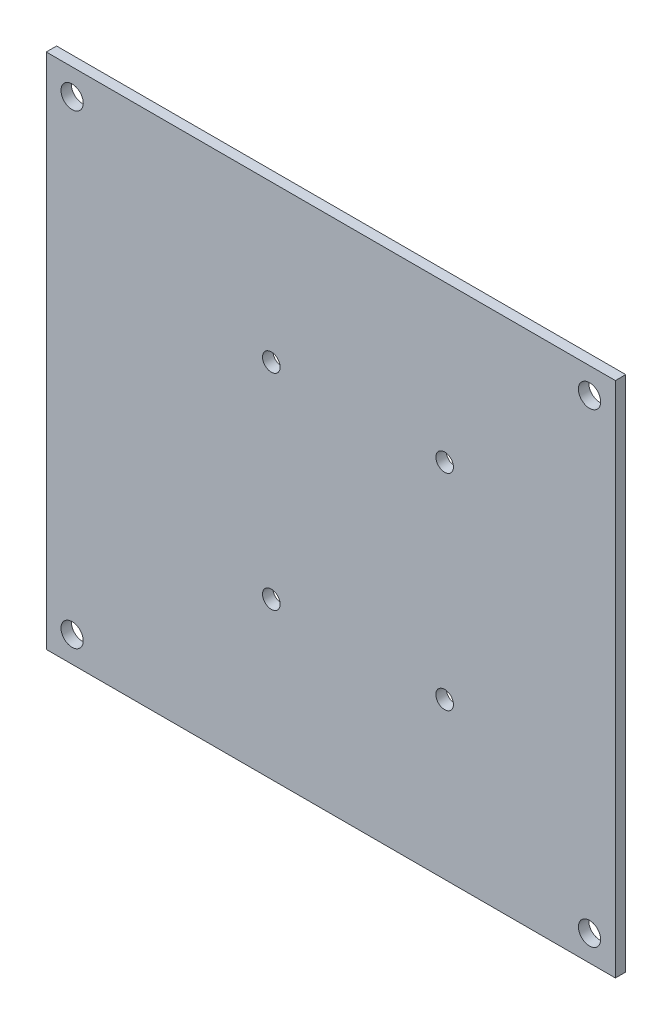
ISO-10303-21;
HEADER;
FILE_DESCRIPTION(('STEP AP214'),'2;1');
FILE_NAME('part.step','',(''),(''),'','','');
FILE_SCHEMA(('AUTOMOTIVE_DESIGN { 1 0 10303 214 1 1 1 1 }'));
ENDSEC;
DATA;
#1=APPLICATION_CONTEXT('core data for automotive mechanical design processes');
#2=APPLICATION_PROTOCOL_DEFINITION('international standard','automotive_design',2000,#1);
#3=PRODUCT_CONTEXT('',#1,'mechanical');
#4=PRODUCT('Part','Part','',(#3));
#5=PRODUCT_RELATED_PRODUCT_CATEGORY('part','',(#4));
#6=PRODUCT_DEFINITION_FORMATION('','',#4);
#7=PRODUCT_DEFINITION_CONTEXT('part definition',#1,'design');
#8=PRODUCT_DEFINITION('design','',#6,#7);
#9=PRODUCT_DEFINITION_SHAPE('','',#8);
#10=(LENGTH_UNIT() NAMED_UNIT(*) SI_UNIT(.MILLI.,.METRE.));
#11=(NAMED_UNIT(*) PLANE_ANGLE_UNIT() SI_UNIT($,.RADIAN.));
#12=(NAMED_UNIT(*) SI_UNIT($,.STERADIAN.) SOLID_ANGLE_UNIT());
#13=UNCERTAINTY_MEASURE_WITH_UNIT(LENGTH_MEASURE(1.E-05),#10,'distance_accuracy_value','');
#14=(GEOMETRIC_REPRESENTATION_CONTEXT(3) GLOBAL_UNCERTAINTY_ASSIGNED_CONTEXT((#13)) GLOBAL_UNIT_ASSIGNED_CONTEXT((#10,
#11,#12)) REPRESENTATION_CONTEXT('',''));
#15=CARTESIAN_POINT('',(0.,0.,0.));
#16=DIRECTION('',(0.,0.,1.));
#17=DIRECTION('',(1.,0.,0.));
#18=AXIS2_PLACEMENT_3D('',#15,#16,#17);
#19=CARTESIAN_POINT('',(0.,0.,1.));
#20=DIRECTION('',(0.,0.,1.));
#21=DIRECTION('',(1.,0.,0.));
#22=AXIS2_PLACEMENT_3D('',#19,#20,#21);
#23=PLANE('',#22);
#24=CARTESIAN_POINT('',(-11.5000000000023,19.8500000000001,1.));
#25=DIRECTION('',(0.,0.,1.));
#26=DIRECTION('',(1.,0.,0.));
#27=AXIS2_PLACEMENT_3D('',#24,#25,#26);
#28=CIRCLE('',#27,1.7);
#29=CARTESIAN_POINT('',(-9.80000000000229,19.8500000000001,1.));
#30=VERTEX_POINT('',#29);
#31=EDGE_CURVE('E300',#30,#30,#28,.T.);
#32=ORIENTED_EDGE('',*,*,#31,.F.);
#33=EDGE_LOOP('',(#32));
#34=FACE_BOUND('',#33,.T.);
#35=CARTESIAN_POINT('',(21.9999999999971,-19.8859328867593,1.));
#36=DIRECTION('',(0.,0.,1.));
#37=DIRECTION('',(1.,0.,0.));
#38=AXIS2_PLACEMENT_3D('',#35,#36,#37);
#39=CIRCLE('',#38,1.7);
#40=CARTESIAN_POINT('',(23.6999999999971,-19.8859328867593,1.));
#41=VERTEX_POINT('',#40);
#42=EDGE_CURVE('E301',#41,#41,#39,.T.);
#43=ORIENTED_EDGE('',*,*,#42,.F.);
#44=EDGE_LOOP('',(#43));
#45=FACE_BOUND('',#44,.T.);
#46=CARTESIAN_POINT('',(-11.5000000000023,-19.8500000000009,1.));
#47=DIRECTION('',(0.,0.,1.));
#48=DIRECTION('',(1.,0.,0.));
#49=AXIS2_PLACEMENT_3D('',#46,#47,#48);
#50=CIRCLE('',#49,1.7);
#51=CARTESIAN_POINT('',(-9.80000000000229,-19.8500000000009,1.));
#52=VERTEX_POINT('',#51);
#53=EDGE_CURVE('E305',#52,#52,#50,.T.);
#54=ORIENTED_EDGE('',*,*,#53,.F.);
#55=EDGE_LOOP('',(#54));
#56=FACE_BOUND('',#55,.T.);
#57=CARTESIAN_POINT('',(21.9999999999971,19.8500000000001,1.));
#58=DIRECTION('',(0.,0.,1.));
#59=DIRECTION('',(1.,0.,0.));
#60=AXIS2_PLACEMENT_3D('',#57,#58,#59);
#61=CIRCLE('',#60,1.7);
#62=CARTESIAN_POINT('',(23.6999999999971,19.8500000000001,1.));
#63=VERTEX_POINT('',#62);
#64=EDGE_CURVE('E115',#63,#63,#61,.T.);
#65=ORIENTED_EDGE('',*,*,#64,.F.);
#66=EDGE_LOOP('',(#65));
#67=FACE_BOUND('',#66,.T.);
#68=CARTESIAN_POINT('',(50.,-45.,1.));
#69=DIRECTION('',(0.,0.,1.));
#70=DIRECTION('',(1.,0.,0.));
#71=AXIS2_PLACEMENT_3D('',#68,#69,#70);
#72=CIRCLE('',#71,2.15);
#73=CARTESIAN_POINT('',(52.15,-45.,1.));
#74=VERTEX_POINT('',#73);
#75=EDGE_CURVE('E135',#74,#74,#72,.T.);
#76=ORIENTED_EDGE('',*,*,#75,.F.);
#77=EDGE_LOOP('',(#76));
#78=FACE_BOUND('',#77,.T.);
#79=CARTESIAN_POINT('',(-50.,45.,1.));
#80=DIRECTION('',(0.,0.,1.));
#81=DIRECTION('',(1.,0.,0.));
#82=AXIS2_PLACEMENT_3D('',#79,#80,#81);
#83=CIRCLE('',#82,2.15);
#84=CARTESIAN_POINT('',(-47.85,45.,1.));
#85=VERTEX_POINT('',#84);
#86=EDGE_CURVE('E105',#85,#85,#83,.T.);
#87=ORIENTED_EDGE('',*,*,#86,.F.);
#88=EDGE_LOOP('',(#87));
#89=FACE_BOUND('',#88,.T.);
#90=DIRECTION('',(0.,1.,0.));
#91=VECTOR('',#90,1.);
#92=CARTESIAN_POINT('',(55.,50.,1.));
#93=LINE('',#92,#91);
#94=CARTESIAN_POINT('',(55.,-50.,1.));
#95=VERTEX_POINT('',#94);
#96=CARTESIAN_POINT('',(55.,50.,1.));
#97=VERTEX_POINT('',#96);
#98=EDGE_CURVE('E89',#95,#97,#93,.T.);
#99=ORIENTED_EDGE('',*,*,#98,.T.);
#100=DIRECTION('',(-1.,0.,0.));
#101=VECTOR('',#100,1.);
#102=CARTESIAN_POINT('',(-55.,50.,1.));
#103=LINE('',#102,#101);
#104=CARTESIAN_POINT('',(-55.,50.,1.));
#105=VERTEX_POINT('',#104);
#106=EDGE_CURVE('E84',#97,#105,#103,.T.);
#107=ORIENTED_EDGE('',*,*,#106,.T.);
#108=DIRECTION('',(0.,-1.,0.));
#109=VECTOR('',#108,1.);
#110=CARTESIAN_POINT('',(-55.,50.,1.));
#111=LINE('',#110,#109);
#112=CARTESIAN_POINT('',(-55.,-50.,1.));
#113=VERTEX_POINT('',#112);
#114=EDGE_CURVE('E87',#105,#113,#111,.T.);
#115=ORIENTED_EDGE('',*,*,#114,.T.);
#116=DIRECTION('',(1.,0.,0.));
#117=VECTOR('',#116,1.);
#118=CARTESIAN_POINT('',(-55.,-50.,1.));
#119=LINE('',#118,#117);
#120=EDGE_CURVE('E54',#113,#95,#119,.T.);
#121=ORIENTED_EDGE('',*,*,#120,.T.);
#122=EDGE_LOOP('',(#99,#107,#115,#121));
#123=FACE_BOUND('',#122,.T.);
#124=CARTESIAN_POINT('',(50.,45.,1.));
#125=DIRECTION('',(0.,0.,1.));
#126=DIRECTION('',(-1.,0.,0.));
#127=AXIS2_PLACEMENT_3D('',#124,#125,#126);
#128=CIRCLE('',#127,2.15);
#129=CARTESIAN_POINT('',(47.85,45.,1.));
#130=VERTEX_POINT('',#129);
#131=EDGE_CURVE('E141',#130,#130,#128,.T.);
#132=ORIENTED_EDGE('',*,*,#131,.F.);
#133=EDGE_LOOP('',(#132));
#134=FACE_BOUND('',#133,.T.);
#135=CARTESIAN_POINT('',(-50.,-45.,1.));
#136=DIRECTION('',(0.,0.,1.));
#137=DIRECTION('',(-1.,0.,0.));
#138=AXIS2_PLACEMENT_3D('',#135,#136,#137);
#139=CIRCLE('',#138,2.15);
#140=CARTESIAN_POINT('',(-52.15,-45.,1.));
#141=VERTEX_POINT('',#140);
#142=EDGE_CURVE('E126',#141,#141,#139,.T.);
#143=ORIENTED_EDGE('',*,*,#142,.F.);
#144=EDGE_LOOP('',(#143));
#145=FACE_BOUND('',#144,.T.);
#146=ADVANCED_FACE('F35',(#34,#45,#56,#67,#78,#89,#123,#134,#145),#23,.T.);
#147=CARTESIAN_POINT('',(0.,0.,-1.));
#148=DIRECTION('',(0.,0.,1.));
#149=DIRECTION('',(1.,0.,0.));
#150=AXIS2_PLACEMENT_3D('',#147,#148,#149);
#151=PLANE('',#150);
#152=CARTESIAN_POINT('',(-11.5000000000023,19.8500000000001,-1.));
#153=DIRECTION('',(0.,0.,1.));
#154=DIRECTION('',(1.,0.,0.));
#155=AXIS2_PLACEMENT_3D('',#152,#153,#154);
#156=CIRCLE('',#155,1.7);
#157=CARTESIAN_POINT('',(-9.80000000000229,19.8500000000001,-1.));
#158=VERTEX_POINT('',#157);
#159=EDGE_CURVE('E39',#158,#158,#156,.T.);
#160=ORIENTED_EDGE('',*,*,#159,.T.);
#161=EDGE_LOOP('',(#160));
#162=FACE_BOUND('',#161,.T.);
#163=CARTESIAN_POINT('',(21.9999999999971,-19.8859328867593,-1.));
#164=DIRECTION('',(0.,0.,1.));
#165=DIRECTION('',(1.,0.,0.));
#166=AXIS2_PLACEMENT_3D('',#163,#164,#165);
#167=CIRCLE('',#166,1.7);
#168=CARTESIAN_POINT('',(23.6999999999971,-19.8859328867593,-1.));
#169=VERTEX_POINT('',#168);
#170=EDGE_CURVE('E117',#169,#169,#167,.T.);
#171=ORIENTED_EDGE('',*,*,#170,.T.);
#172=EDGE_LOOP('',(#171));
#173=FACE_BOUND('',#172,.T.);
#174=CARTESIAN_POINT('',(-11.5000000000023,-19.8500000000009,-1.));
#175=DIRECTION('',(0.,0.,1.));
#176=DIRECTION('',(1.,0.,0.));
#177=AXIS2_PLACEMENT_3D('',#174,#175,#176);
#178=CIRCLE('',#177,1.7);
#179=CARTESIAN_POINT('',(-9.80000000000229,-19.8500000000009,-1.));
#180=VERTEX_POINT('',#179);
#181=EDGE_CURVE('E114',#180,#180,#178,.T.);
#182=ORIENTED_EDGE('',*,*,#181,.T.);
#183=EDGE_LOOP('',(#182));
#184=FACE_BOUND('',#183,.T.);
#185=CARTESIAN_POINT('',(21.9999999999971,19.8500000000001,-1.));
#186=DIRECTION('',(0.,0.,1.));
#187=DIRECTION('',(1.,0.,0.));
#188=AXIS2_PLACEMENT_3D('',#185,#186,#187);
#189=CIRCLE('',#188,1.7);
#190=CARTESIAN_POINT('',(23.6999999999971,19.8500000000001,-1.));
#191=VERTEX_POINT('',#190);
#192=EDGE_CURVE('E111',#191,#191,#189,.T.);
#193=ORIENTED_EDGE('',*,*,#192,.T.);
#194=EDGE_LOOP('',(#193));
#195=FACE_BOUND('',#194,.T.);
#196=DIRECTION('',(0.,1.,0.));
#197=VECTOR('',#196,1.);
#198=CARTESIAN_POINT('',(55.,50.,-1.));
#199=LINE('',#198,#197);
#200=CARTESIAN_POINT('',(55.,-50.,-1.));
#201=VERTEX_POINT('',#200);
#202=CARTESIAN_POINT('',(55.,50.,-1.));
#203=VERTEX_POINT('',#202);
#204=EDGE_CURVE('E102',#201,#203,#199,.T.);
#205=ORIENTED_EDGE('',*,*,#204,.F.);
#206=DIRECTION('',(1.,0.,0.));
#207=VECTOR('',#206,1.);
#208=CARTESIAN_POINT('',(-55.,-50.,-1.));
#209=LINE('',#208,#207);
#210=CARTESIAN_POINT('',(-55.,-50.,-1.));
#211=VERTEX_POINT('',#210);
#212=EDGE_CURVE('E77',#211,#201,#209,.T.);
#213=ORIENTED_EDGE('',*,*,#212,.F.);
#214=DIRECTION('',(0.,-1.,0.));
#215=VECTOR('',#214,1.);
#216=CARTESIAN_POINT('',(-55.,50.,-1.));
#217=LINE('',#216,#215);
#218=CARTESIAN_POINT('',(-55.,50.,-1.));
#219=VERTEX_POINT('',#218);
#220=EDGE_CURVE('E71',#219,#211,#217,.T.);
#221=ORIENTED_EDGE('',*,*,#220,.F.);
#222=DIRECTION('',(-1.,0.,0.));
#223=VECTOR('',#222,1.);
#224=CARTESIAN_POINT('',(-55.,50.,-1.));
#225=LINE('',#224,#223);
#226=EDGE_CURVE('E93',#203,#219,#225,.T.);
#227=ORIENTED_EDGE('',*,*,#226,.F.);
#228=EDGE_LOOP('',(#205,#213,#221,#227));
#229=FACE_BOUND('',#228,.T.);
#230=CARTESIAN_POINT('',(-50.,45.,-1.));
#231=DIRECTION('',(0.,0.,1.));
#232=DIRECTION('',(1.,0.,0.));
#233=AXIS2_PLACEMENT_3D('',#230,#231,#232);
#234=CIRCLE('',#233,2.15);
#235=CARTESIAN_POINT('',(-47.85,45.,-1.));
#236=VERTEX_POINT('',#235);
#237=EDGE_CURVE('E144',#236,#236,#234,.T.);
#238=ORIENTED_EDGE('',*,*,#237,.T.);
#239=EDGE_LOOP('',(#238));
#240=FACE_BOUND('',#239,.T.);
#241=CARTESIAN_POINT('',(50.,45.,-1.));
#242=DIRECTION('',(0.,0.,1.));
#243=DIRECTION('',(-1.,0.,0.));
#244=AXIS2_PLACEMENT_3D('',#241,#242,#243);
#245=CIRCLE('',#244,2.15);
#246=CARTESIAN_POINT('',(47.85,45.,-1.));
#247=VERTEX_POINT('',#246);
#248=EDGE_CURVE('E138',#247,#247,#245,.T.);
#249=ORIENTED_EDGE('',*,*,#248,.T.);
#250=EDGE_LOOP('',(#249));
#251=FACE_BOUND('',#250,.T.);
#252=CARTESIAN_POINT('',(50.,-45.,-1.));
#253=DIRECTION('',(0.,0.,1.));
#254=DIRECTION('',(1.,0.,0.));
#255=AXIS2_PLACEMENT_3D('',#252,#253,#254);
#256=CIRCLE('',#255,2.15);
#257=CARTESIAN_POINT('',(52.15,-45.,-1.));
#258=VERTEX_POINT('',#257);
#259=EDGE_CURVE('E131',#258,#258,#256,.T.);
#260=ORIENTED_EDGE('',*,*,#259,.T.);
#261=EDGE_LOOP('',(#260));
#262=FACE_BOUND('',#261,.T.);
#263=CARTESIAN_POINT('',(-50.,-45.,-1.));
#264=DIRECTION('',(0.,0.,1.));
#265=DIRECTION('',(-1.,0.,0.));
#266=AXIS2_PLACEMENT_3D('',#263,#264,#265);
#267=CIRCLE('',#266,2.15);
#268=CARTESIAN_POINT('',(-52.15,-45.,-1.));
#269=VERTEX_POINT('',#268);
#270=EDGE_CURVE('E122',#269,#269,#267,.T.);
#271=ORIENTED_EDGE('',*,*,#270,.T.);
#272=EDGE_LOOP('',(#271));
#273=FACE_BOUND('',#272,.T.);
#274=ADVANCED_FACE('F152',(#162,#173,#184,#195,#229,#240,#251,#262,#273),#151,.F.);
#275=CARTESIAN_POINT('',(55.,50.,1.));
#276=DIRECTION('',(-1.,0.,0.));
#277=DIRECTION('',(0.,0.,1.));
#278=AXIS2_PLACEMENT_3D('',#275,#276,#277);
#279=PLANE('',#278);
#280=ORIENTED_EDGE('',*,*,#204,.T.);
#281=DIRECTION('',(0.,0.,-1.));
#282=VECTOR('',#281,1.);
#283=CARTESIAN_POINT('',(55.,50.,1.));
#284=LINE('',#283,#282);
#285=EDGE_CURVE('E11',#97,#203,#284,.T.);
#286=ORIENTED_EDGE('',*,*,#285,.F.);
#287=ORIENTED_EDGE('',*,*,#98,.F.);
#288=DIRECTION('',(0.,0.,-1.));
#289=VECTOR('',#288,1.);
#290=CARTESIAN_POINT('',(55.,-50.,1.));
#291=LINE('',#290,#289);
#292=EDGE_CURVE('E98',#95,#201,#291,.T.);
#293=ORIENTED_EDGE('',*,*,#292,.T.);
#294=EDGE_LOOP('',(#280,#286,#287,#293));
#295=FACE_BOUND('',#294,.T.);
#296=ADVANCED_FACE('F37',(#295),#279,.F.);
#297=CARTESIAN_POINT('',(-55.,50.,1.));
#298=DIRECTION('',(0.,-1.,0.));
#299=DIRECTION('',(0.,0.,-1.));
#300=AXIS2_PLACEMENT_3D('',#297,#298,#299);
#301=PLANE('',#300);
#302=ORIENTED_EDGE('',*,*,#226,.T.);
#303=DIRECTION('',(0.,0.,-1.));
#304=VECTOR('',#303,1.);
#305=CARTESIAN_POINT('',(-55.,50.,1.));
#306=LINE('',#305,#304);
#307=EDGE_CURVE('E45',#105,#219,#306,.T.);
#308=ORIENTED_EDGE('',*,*,#307,.F.);
#309=ORIENTED_EDGE('',*,*,#106,.F.);
#310=ORIENTED_EDGE('',*,*,#285,.T.);
#311=EDGE_LOOP('',(#302,#308,#309,#310));
#312=FACE_BOUND('',#311,.T.);
#313=ADVANCED_FACE('F92',(#312),#301,.F.);
#314=CARTESIAN_POINT('',(-55.,50.,1.));
#315=DIRECTION('',(1.,0.,0.));
#316=DIRECTION('',(0.,0.,-1.));
#317=AXIS2_PLACEMENT_3D('',#314,#315,#316);
#318=PLANE('',#317);
#319=ORIENTED_EDGE('',*,*,#220,.T.);
#320=DIRECTION('',(0.,0.,-1.));
#321=VECTOR('',#320,1.);
#322=CARTESIAN_POINT('',(-55.,-50.,1.));
#323=LINE('',#322,#321);
#324=EDGE_CURVE('E94',#113,#211,#323,.T.);
#325=ORIENTED_EDGE('',*,*,#324,.F.);
#326=ORIENTED_EDGE('',*,*,#114,.F.);
#327=ORIENTED_EDGE('',*,*,#307,.T.);
#328=EDGE_LOOP('',(#319,#325,#326,#327));
#329=FACE_BOUND('',#328,.T.);
#330=ADVANCED_FACE('F96',(#329),#318,.F.);
#331=CARTESIAN_POINT('',(-55.,-50.,1.));
#332=DIRECTION('',(0.,1.,0.));
#333=DIRECTION('',(0.,0.,1.));
#334=AXIS2_PLACEMENT_3D('',#331,#332,#333);
#335=PLANE('',#334);
#336=ORIENTED_EDGE('',*,*,#212,.T.);
#337=ORIENTED_EDGE('',*,*,#292,.F.);
#338=ORIENTED_EDGE('',*,*,#120,.F.);
#339=ORIENTED_EDGE('',*,*,#324,.T.);
#340=EDGE_LOOP('',(#336,#337,#338,#339));
#341=FACE_BOUND('',#340,.T.);
#342=ADVANCED_FACE('F158',(#341),#335,.F.);
#343=CARTESIAN_POINT('',(-50.,45.,1.));
#344=DIRECTION('',(0.,0.,-1.));
#345=DIRECTION('',(-1.,0.,0.));
#346=AXIS2_PLACEMENT_3D('',#343,#344,#345);
#347=CYLINDRICAL_SURFACE('',#346,2.15);
#348=ORIENTED_EDGE('',*,*,#86,.T.);
#349=EDGE_LOOP('',(#348));
#350=FACE_BOUND('',#349,.T.);
#351=ORIENTED_EDGE('',*,*,#237,.F.);
#352=EDGE_LOOP('',(#351));
#353=FACE_BOUND('',#352,.T.);
#354=ADVANCED_FACE('F155',(#350,#353),#347,.F.);
#355=CARTESIAN_POINT('',(50.,45.,1.));
#356=DIRECTION('',(0.,0.,-1.));
#357=DIRECTION('',(-1.,0.,0.));
#358=AXIS2_PLACEMENT_3D('',#355,#356,#357);
#359=CYLINDRICAL_SURFACE('',#358,2.15);
#360=ORIENTED_EDGE('',*,*,#131,.T.);
#361=EDGE_LOOP('',(#360));
#362=FACE_BOUND('',#361,.T.);
#363=ORIENTED_EDGE('',*,*,#248,.F.);
#364=EDGE_LOOP('',(#363));
#365=FACE_BOUND('',#364,.T.);
#366=ADVANCED_FACE('F157',(#362,#365),#359,.F.);
#367=CARTESIAN_POINT('',(50.,-45.,1.));
#368=DIRECTION('',(0.,0.,-1.));
#369=DIRECTION('',(-1.,0.,0.));
#370=AXIS2_PLACEMENT_3D('',#367,#368,#369);
#371=CYLINDRICAL_SURFACE('',#370,2.15);
#372=ORIENTED_EDGE('',*,*,#75,.T.);
#373=EDGE_LOOP('',(#372));
#374=FACE_BOUND('',#373,.T.);
#375=ORIENTED_EDGE('',*,*,#259,.F.);
#376=EDGE_LOOP('',(#375));
#377=FACE_BOUND('',#376,.T.);
#378=ADVANCED_FACE('F165',(#374,#377),#371,.F.);
#379=CARTESIAN_POINT('',(-50.,-45.,1.));
#380=DIRECTION('',(0.,0.,-1.));
#381=DIRECTION('',(-1.,0.,0.));
#382=AXIS2_PLACEMENT_3D('',#379,#380,#381);
#383=CYLINDRICAL_SURFACE('',#382,2.15);
#384=ORIENTED_EDGE('',*,*,#142,.T.);
#385=EDGE_LOOP('',(#384));
#386=FACE_BOUND('',#385,.T.);
#387=ORIENTED_EDGE('',*,*,#270,.F.);
#388=EDGE_LOOP('',(#387));
#389=FACE_BOUND('',#388,.T.);
#390=ADVANCED_FACE('F209',(#386,#389),#383,.F.);
#391=CARTESIAN_POINT('',(21.9999999999971,19.8500000000001,-14.));
#392=DIRECTION('',(0.,0.,1.));
#393=DIRECTION('',(1.,0.,0.));
#394=AXIS2_PLACEMENT_3D('',#391,#392,#393);
#395=CYLINDRICAL_SURFACE('',#394,1.7);
#396=ORIENTED_EDGE('',*,*,#64,.T.);
#397=EDGE_LOOP('',(#396));
#398=FACE_BOUND('',#397,.T.);
#399=ORIENTED_EDGE('',*,*,#192,.F.);
#400=EDGE_LOOP('',(#399));
#401=FACE_BOUND('',#400,.T.);
#402=ADVANCED_FACE('F203',(#398,#401),#395,.F.);
#403=CARTESIAN_POINT('',(-11.5000000000023,-19.8500000000009,-14.));
#404=DIRECTION('',(0.,0.,1.));
#405=DIRECTION('',(1.,0.,0.));
#406=AXIS2_PLACEMENT_3D('',#403,#404,#405);
#407=CYLINDRICAL_SURFACE('',#406,1.7);
#408=ORIENTED_EDGE('',*,*,#53,.T.);
#409=EDGE_LOOP('',(#408));
#410=FACE_BOUND('',#409,.T.);
#411=ORIENTED_EDGE('',*,*,#181,.F.);
#412=EDGE_LOOP('',(#411));
#413=FACE_BOUND('',#412,.T.);
#414=ADVANCED_FACE('F208',(#410,#413),#407,.F.);
#415=CARTESIAN_POINT('',(21.9999999999971,-19.8859328867593,-14.));
#416=DIRECTION('',(0.,0.,1.));
#417=DIRECTION('',(1.,0.,0.));
#418=AXIS2_PLACEMENT_3D('',#415,#416,#417);
#419=CYLINDRICAL_SURFACE('',#418,1.7);
#420=ORIENTED_EDGE('',*,*,#42,.T.);
#421=EDGE_LOOP('',(#420));
#422=FACE_BOUND('',#421,.T.);
#423=ORIENTED_EDGE('',*,*,#170,.F.);
#424=EDGE_LOOP('',(#423));
#425=FACE_BOUND('',#424,.T.);
#426=ADVANCED_FACE('F221',(#422,#425),#419,.F.);
#427=CARTESIAN_POINT('',(-11.5000000000023,19.8500000000001,-14.));
#428=DIRECTION('',(0.,0.,1.));
#429=DIRECTION('',(1.,0.,0.));
#430=AXIS2_PLACEMENT_3D('',#427,#428,#429);
#431=CYLINDRICAL_SURFACE('',#430,1.7);
#432=ORIENTED_EDGE('',*,*,#31,.T.);
#433=EDGE_LOOP('',(#432));
#434=FACE_BOUND('',#433,.T.);
#435=ORIENTED_EDGE('',*,*,#159,.F.);
#436=EDGE_LOOP('',(#435));
#437=FACE_BOUND('',#436,.T.);
#438=ADVANCED_FACE('F231',(#434,#437),#431,.F.);
#439=CLOSED_SHELL('',(#146,#274,#296,#313,#330,#342,#354,#366,#378,#390,#402,#414,#426,#438));
#440=MANIFOLD_SOLID_BREP('B2',#439);
#441=ADVANCED_BREP_SHAPE_REPRESENTATION('',(#18,#440),#14);
#442=SHAPE_DEFINITION_REPRESENTATION(#9,#441);
ENDSEC;
END-ISO-10303-21;
